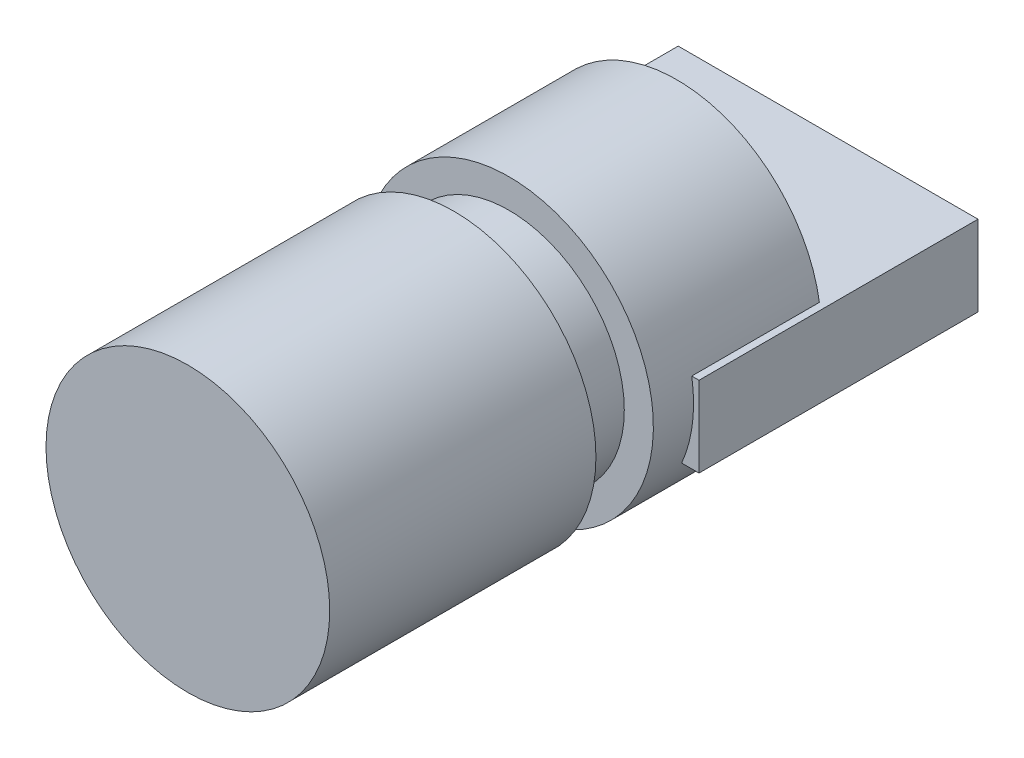
ISO-10303-21;
HEADER;
FILE_DESCRIPTION(('STEP AP214'),'2;1');
FILE_NAME('part.step','',(''),(''),'','','');
FILE_SCHEMA(('AUTOMOTIVE_DESIGN { 1 0 10303 214 1 1 1 1 }'));
ENDSEC;
DATA;
#1=APPLICATION_CONTEXT('core data for automotive mechanical design processes');
#2=APPLICATION_PROTOCOL_DEFINITION('international standard','automotive_design',2000,#1);
#3=PRODUCT_CONTEXT('',#1,'mechanical');
#4=PRODUCT('Part','Part','',(#3));
#5=PRODUCT_RELATED_PRODUCT_CATEGORY('part','',(#4));
#6=PRODUCT_DEFINITION_FORMATION('','',#4);
#7=PRODUCT_DEFINITION_CONTEXT('part definition',#1,'design');
#8=PRODUCT_DEFINITION('design','',#6,#7);
#9=PRODUCT_DEFINITION_SHAPE('','',#8);
#10=(LENGTH_UNIT() NAMED_UNIT(*) SI_UNIT(.MILLI.,.METRE.));
#11=(NAMED_UNIT(*) PLANE_ANGLE_UNIT() SI_UNIT($,.RADIAN.));
#12=(NAMED_UNIT(*) SI_UNIT($,.STERADIAN.) SOLID_ANGLE_UNIT());
#13=UNCERTAINTY_MEASURE_WITH_UNIT(LENGTH_MEASURE(1.E-05),#10,'distance_accuracy_value','');
#14=(GEOMETRIC_REPRESENTATION_CONTEXT(3) GLOBAL_UNCERTAINTY_ASSIGNED_CONTEXT((#13)) GLOBAL_UNIT_ASSIGNED_CONTEXT((#10,
#11,#12)) REPRESENTATION_CONTEXT('',''));
#15=CARTESIAN_POINT('',(0.,0.,0.));
#16=DIRECTION('',(0.,0.,1.));
#17=DIRECTION('',(1.,0.,0.));
#18=AXIS2_PLACEMENT_3D('',#15,#16,#17);
#19=CARTESIAN_POINT('',(-7.67170946047865,4.79889910932069,-4.71));
#20=DIRECTION('',(0.,0.,-1.));
#21=DIRECTION('',(-1.,0.,0.));
#22=AXIS2_PLACEMENT_3D('',#19,#20,#21);
#23=PLANE('',#22);
#24=CARTESIAN_POINT('',(-7.67170946047865,4.79889910932069,-4.71));
#25=DIRECTION('',(0.,0.,-1.));
#26=DIRECTION('',(-1.,0.,0.));
#27=AXIS2_PLACEMENT_3D('',#24,#25,#26);
#28=CIRCLE('',#27,3.055);
#29=CARTESIAN_POINT('',(-4.86871106590187,3.58389910932069,-4.71));
#30=VERTEX_POINT('',#29);
#31=CARTESIAN_POINT('',(-10.4747078550554,3.58389910932069,-4.71));
#32=VERTEX_POINT('',#31);
#33=EDGE_CURVE('E181',#30,#32,#28,.T.);
#34=ORIENTED_EDGE('',*,*,#33,.T.);
#35=DIRECTION('',(1.,0.,0.));
#36=VECTOR('',#35,1.);
#37=CARTESIAN_POINT('',(-7.67170946047865,3.58389910932069,-4.71));
#38=LINE('',#37,#36);
#39=EDGE_CURVE('E195',#32,#30,#38,.T.);
#40=ORIENTED_EDGE('',*,*,#39,.T.);
#41=EDGE_LOOP('',(#34,#40));
#42=FACE_BOUND('',#41,.T.);
#43=ADVANCED_FACE('F59',(#42),#23,.T.);
#44=CARTESIAN_POINT('',(-7.67170946047865,4.79889910932069,5.63));
#45=DIRECTION('',(0.,0.,-1.));
#46=DIRECTION('',(-1.,0.,0.));
#47=AXIS2_PLACEMENT_3D('',#44,#45,#46);
#48=CYLINDRICAL_SURFACE('',#47,3.);
#49=CARTESIAN_POINT('',(-7.67170946047865,4.79889910932069,5.63));
#50=DIRECTION('',(0.,0.,1.));
#51=DIRECTION('',(1.,0.,0.));
#52=AXIS2_PLACEMENT_3D('',#49,#50,#51);
#53=CIRCLE('',#52,3.);
#54=CARTESIAN_POINT('',(-4.67170946047865,4.79889910932069,5.63));
#55=VERTEX_POINT('',#54);
#56=EDGE_CURVE('E187',#55,#55,#53,.T.);
#57=ORIENTED_EDGE('',*,*,#56,.F.);
#58=EDGE_LOOP('',(#57));
#59=FACE_BOUND('',#58,.T.);
#60=CARTESIAN_POINT('',(-7.67170946047865,4.79889910932069,0.));
#61=DIRECTION('',(0.,0.,1.));
#62=DIRECTION('',(1.,0.,0.));
#63=AXIS2_PLACEMENT_3D('',#60,#61,#62);
#64=CIRCLE('',#63,3.);
#65=CARTESIAN_POINT('',(-4.67170946047865,4.79889910932069,0.));
#66=VERTEX_POINT('',#65);
#67=EDGE_CURVE('E186',#66,#66,#64,.T.);
#68=ORIENTED_EDGE('',*,*,#67,.T.);
#69=EDGE_LOOP('',(#68));
#70=FACE_BOUND('',#69,.T.);
#71=ADVANCED_FACE('F61',(#59,#70),#48,.T.);
#72=CARTESIAN_POINT('',(-7.67170946047865,4.79889910932069,5.63));
#73=DIRECTION('',(0.,0.,1.));
#74=DIRECTION('',(1.,0.,0.));
#75=AXIS2_PLACEMENT_3D('',#72,#73,#74);
#76=PLANE('',#75);
#77=ORIENTED_EDGE('',*,*,#56,.T.);
#78=EDGE_LOOP('',(#77));
#79=FACE_BOUND('',#78,.T.);
#80=ADVANCED_FACE('F231',(#79),#76,.T.);
#81=CARTESIAN_POINT('',(-7.67170946047865,4.79889910932069,0.));
#82=DIRECTION('',(0.,0.,1.));
#83=DIRECTION('',(1.,0.,0.));
#84=AXIS2_PLACEMENT_3D('',#81,#82,#83);
#85=PLANE('',#84);
#86=CARTESIAN_POINT('',(-7.67170946047865,4.79889910932069,0.));
#87=DIRECTION('',(0.,0.,1.));
#88=DIRECTION('',(1.,0.,0.));
#89=AXIS2_PLACEMENT_3D('',#86,#87,#88);
#90=CIRCLE('',#89,2.44);
#91=CARTESIAN_POINT('',(-5.23170946047865,4.79889910932069,0.));
#92=VERTEX_POINT('',#91);
#93=EDGE_CURVE('E190',#92,#92,#90,.F.);
#94=ORIENTED_EDGE('',*,*,#93,.F.);
#95=EDGE_LOOP('',(#94));
#96=FACE_BOUND('',#95,.T.);
#97=ORIENTED_EDGE('',*,*,#67,.F.);
#98=EDGE_LOOP('',(#97));
#99=FACE_BOUND('',#98,.T.);
#100=ADVANCED_FACE('F236',(#96,#99),#85,.F.);
#101=CARTESIAN_POINT('',(-7.67170946047865,4.79889910932069,-1.16));
#102=DIRECTION('',(0.,0.,1.));
#103=DIRECTION('',(1.,0.,0.));
#104=AXIS2_PLACEMENT_3D('',#101,#102,#103);
#105=CYLINDRICAL_SURFACE('',#104,2.44);
#106=CARTESIAN_POINT('',(-7.67170946047865,4.79889910932069,-1.16));
#107=DIRECTION('',(0.,0.,-1.));
#108=DIRECTION('',(-1.,0.,0.));
#109=AXIS2_PLACEMENT_3D('',#106,#107,#108);
#110=CIRCLE('',#109,2.44);
#111=CARTESIAN_POINT('',(-10.1117094604786,4.79889910932069,-1.16));
#112=VERTEX_POINT('',#111);
#113=EDGE_CURVE('E180',#112,#112,#110,.T.);
#114=ORIENTED_EDGE('',*,*,#113,.F.);
#115=EDGE_LOOP('',(#114));
#116=FACE_BOUND('',#115,.T.);
#117=ORIENTED_EDGE('',*,*,#93,.T.);
#118=EDGE_LOOP('',(#117));
#119=FACE_BOUND('',#118,.T.);
#120=ADVANCED_FACE('F223',(#116,#119),#105,.T.);
#121=CARTESIAN_POINT('',(-7.67170946047865,4.79889910932069,-4.71));
#122=DIRECTION('',(0.,0.,1.));
#123=DIRECTION('',(1.,0.,0.));
#124=AXIS2_PLACEMENT_3D('',#121,#122,#123);
#125=CYLINDRICAL_SURFACE('',#124,3.055);
#126=CARTESIAN_POINT('',(-10.6879654177873,5.28389910932069,-4.71));
#127=VERTEX_POINT('',#126);
#128=CARTESIAN_POINT('',(-4.65545350316999,5.28389910932069,-4.71));
#129=VERTEX_POINT('',#128);
#130=EDGE_CURVE('E177',#127,#129,#28,.T.);
#131=ORIENTED_EDGE('',*,*,#130,.F.);
#132=DIRECTION('',(0.,0.,1.));
#133=VECTOR('',#132,1.);
#134=CARTESIAN_POINT('',(-10.6879654177873,5.28389910932069,-4.71));
#135=LINE('',#134,#133);
#136=CARTESIAN_POINT('',(-10.6879654177873,5.28389910932069,-2.01));
#137=VERTEX_POINT('',#136);
#138=EDGE_CURVE('E173',#127,#137,#135,.T.);
#139=ORIENTED_EDGE('',*,*,#138,.T.);
#140=CARTESIAN_POINT('',(-7.67170946047865,4.79889910932069,-2.01));
#141=DIRECTION('',(0.,0.,1.));
#142=DIRECTION('',(1.,0.,0.));
#143=AXIS2_PLACEMENT_3D('',#140,#141,#142);
#144=CIRCLE('',#143,3.055);
#145=CARTESIAN_POINT('',(-10.4747078550554,3.58389910932069,-2.01));
#146=VERTEX_POINT('',#145);
#147=EDGE_CURVE('E12',#137,#146,#144,.T.);
#148=ORIENTED_EDGE('',*,*,#147,.T.);
#149=DIRECTION('',(0.,0.,1.));
#150=VECTOR('',#149,1.);
#151=CARTESIAN_POINT('',(-10.4747078550554,3.58389910932069,-4.71));
#152=LINE('',#151,#150);
#153=EDGE_CURVE('E169',#32,#146,#152,.T.);
#154=ORIENTED_EDGE('',*,*,#153,.F.);
#155=ORIENTED_EDGE('',*,*,#33,.F.);
#156=DIRECTION('',(0.,0.,1.));
#157=VECTOR('',#156,1.);
#158=CARTESIAN_POINT('',(-4.86871106590187,3.58389910932069,-4.71));
#159=LINE('',#158,#157);
#160=CARTESIAN_POINT('',(-4.86871106590187,3.58389910932069,-2.01));
#161=VERTEX_POINT('',#160);
#162=EDGE_CURVE('E74',#161,#30,#159,.F.);
#163=ORIENTED_EDGE('',*,*,#162,.F.);
#164=CARTESIAN_POINT('',(-4.65545350316999,5.28389910932069,-2.01));
#165=VERTEX_POINT('',#164);
#166=EDGE_CURVE('E63',#161,#165,#144,.T.);
#167=ORIENTED_EDGE('',*,*,#166,.T.);
#168=DIRECTION('',(0.,0.,1.));
#169=VECTOR('',#168,1.);
#170=CARTESIAN_POINT('',(-4.65545350316999,5.28389910932069,-4.71));
#171=LINE('',#170,#169);
#172=EDGE_CURVE('E171',#165,#129,#171,.F.);
#173=ORIENTED_EDGE('',*,*,#172,.T.);
#174=EDGE_LOOP('',(#131,#139,#148,#154,#155,#163,#167,#173));
#175=FACE_BOUND('',#174,.T.);
#176=CARTESIAN_POINT('',(-7.67170946047865,4.79889910932069,-1.16));
#177=DIRECTION('',(0.,0.,-1.));
#178=DIRECTION('',(-1.,0.,0.));
#179=AXIS2_PLACEMENT_3D('',#176,#177,#178);
#180=CIRCLE('',#179,3.055);
#181=CARTESIAN_POINT('',(-10.7267094604786,4.79889910932069,-1.16));
#182=VERTEX_POINT('',#181);
#183=EDGE_CURVE('E176',#182,#182,#180,.T.);
#184=ORIENTED_EDGE('',*,*,#183,.T.);
#185=EDGE_LOOP('',(#184));
#186=FACE_BOUND('',#185,.T.);
#187=ADVANCED_FACE('F198',(#175,#186),#125,.T.);
#188=DIRECTION('',(1.,0.,0.));
#189=VECTOR('',#188,1.);
#190=CARTESIAN_POINT('',(-7.67170946047865,5.28389910932069,-4.71));
#191=LINE('',#190,#189);
#192=EDGE_CURVE('E82',#127,#129,#191,.T.);
#193=ORIENTED_EDGE('',*,*,#192,.F.);
#194=ORIENTED_EDGE('',*,*,#130,.T.);
#195=EDGE_LOOP('',(#193,#194));
#196=FACE_BOUND('',#195,.T.);
#197=ADVANCED_FACE('F212',(#196),#23,.T.);
#198=CARTESIAN_POINT('',(-7.67170946047865,4.79889910932069,-1.16));
#199=DIRECTION('',(0.,0.,-1.));
#200=DIRECTION('',(-1.,0.,0.));
#201=AXIS2_PLACEMENT_3D('',#198,#199,#200);
#202=PLANE('',#201);
#203=ORIENTED_EDGE('',*,*,#113,.T.);
#204=EDGE_LOOP('',(#203));
#205=FACE_BOUND('',#204,.T.);
#206=ORIENTED_EDGE('',*,*,#183,.F.);
#207=EDGE_LOOP('',(#206));
#208=FACE_BOUND('',#207,.T.);
#209=ADVANCED_FACE('F214',(#205,#208),#202,.F.);
#210=CARTESIAN_POINT('',(0.,3.58389910932069,-2.01));
#211=DIRECTION('',(0.,0.,1.));
#212=DIRECTION('',(1.,0.,0.));
#213=AXIS2_PLACEMENT_3D('',#210,#211,#212);
#214=PLANE('',#213);
#215=ORIENTED_EDGE('',*,*,#147,.F.);
#216=DIRECTION('',(1.,0.,0.));
#217=VECTOR('',#216,1.);
#218=CARTESIAN_POINT('',(0.,5.28389910932069,-2.01));
#219=LINE('',#218,#217);
#220=CARTESIAN_POINT('',(-10.8417094604786,5.28389910932069,-2.01));
#221=VERTEX_POINT('',#220);
#222=EDGE_CURVE('E153',#221,#137,#219,.T.);
#223=ORIENTED_EDGE('',*,*,#222,.F.);
#224=DIRECTION('',(0.,1.,0.));
#225=VECTOR('',#224,1.);
#226=CARTESIAN_POINT('',(-10.8417094604786,3.58389910932069,-2.01));
#227=LINE('',#226,#225);
#228=CARTESIAN_POINT('',(-10.8417094604786,3.58389910932069,-2.01));
#229=VERTEX_POINT('',#228);
#230=EDGE_CURVE('E162',#229,#221,#227,.T.);
#231=ORIENTED_EDGE('',*,*,#230,.F.);
#232=DIRECTION('',(1.,0.,0.));
#233=VECTOR('',#232,1.);
#234=CARTESIAN_POINT('',(0.,3.58389910932069,-2.01));
#235=LINE('',#234,#233);
#236=EDGE_CURVE('E132',#229,#146,#235,.T.);
#237=ORIENTED_EDGE('',*,*,#236,.T.);
#238=EDGE_LOOP('',(#215,#223,#231,#237));
#239=FACE_BOUND('',#238,.T.);
#240=ADVANCED_FACE('F206',(#239),#214,.T.);
#241=CARTESIAN_POINT('',(0.,5.28389910932069,0.));
#242=DIRECTION('',(0.,1.,0.));
#243=DIRECTION('',(0.,0.,1.));
#244=AXIS2_PLACEMENT_3D('',#241,#242,#243);
#245=PLANE('',#244);
#246=ORIENTED_EDGE('',*,*,#138,.F.);
#247=ORIENTED_EDGE('',*,*,#192,.T.);
#248=ORIENTED_EDGE('',*,*,#172,.F.);
#249=CARTESIAN_POINT('',(-4.50170946047865,5.28389910932069,-2.01));
#250=VERTEX_POINT('',#249);
#251=EDGE_CURVE('E156',#165,#250,#219,.T.);
#252=ORIENTED_EDGE('',*,*,#251,.T.);
#253=DIRECTION('',(0.,0.,-1.));
#254=VECTOR('',#253,1.);
#255=CARTESIAN_POINT('',(-4.50170946047865,5.28389910932069,0.));
#256=LINE('',#255,#254);
#257=CARTESIAN_POINT('',(-4.50170946047865,5.28389910932069,-7.91));
#258=VERTEX_POINT('',#257);
#259=EDGE_CURVE('E140',#250,#258,#256,.T.);
#260=ORIENTED_EDGE('',*,*,#259,.T.);
#261=DIRECTION('',(1.,0.,0.));
#262=VECTOR('',#261,1.);
#263=CARTESIAN_POINT('',(0.,5.28389910932069,-7.91));
#264=LINE('',#263,#262);
#265=CARTESIAN_POINT('',(-10.8417094604786,5.28389910932069,-7.91));
#266=VERTEX_POINT('',#265);
#267=EDGE_CURVE('E158',#266,#258,#264,.T.);
#268=ORIENTED_EDGE('',*,*,#267,.F.);
#269=DIRECTION('',(0.,0.,-1.));
#270=VECTOR('',#269,1.);
#271=CARTESIAN_POINT('',(-10.8417094604786,5.28389910932069,0.));
#272=LINE('',#271,#270);
#273=EDGE_CURVE('E133',#221,#266,#272,.T.);
#274=ORIENTED_EDGE('',*,*,#273,.F.);
#275=ORIENTED_EDGE('',*,*,#222,.T.);
#276=EDGE_LOOP('',(#246,#247,#248,#252,#260,#268,#274,#275));
#277=FACE_BOUND('',#276,.T.);
#278=ADVANCED_FACE('F209',(#277),#245,.T.);
#279=CARTESIAN_POINT('',(0.,3.58389910932069,0.));
#280=DIRECTION('',(0.,1.,0.));
#281=DIRECTION('',(0.,0.,1.));
#282=AXIS2_PLACEMENT_3D('',#279,#280,#281);
#283=PLANE('',#282);
#284=ORIENTED_EDGE('',*,*,#39,.F.);
#285=ORIENTED_EDGE('',*,*,#153,.T.);
#286=ORIENTED_EDGE('',*,*,#236,.F.);
#287=DIRECTION('',(0.,0.,-1.));
#288=VECTOR('',#287,1.);
#289=CARTESIAN_POINT('',(-10.8417094604786,3.58389910932069,0.));
#290=LINE('',#289,#288);
#291=CARTESIAN_POINT('',(-10.8417094604786,3.58389910932069,-7.91));
#292=VERTEX_POINT('',#291);
#293=EDGE_CURVE('E142',#229,#292,#290,.T.);
#294=ORIENTED_EDGE('',*,*,#293,.T.);
#295=DIRECTION('',(1.,0.,0.));
#296=VECTOR('',#295,1.);
#297=CARTESIAN_POINT('',(0.,3.58389910932069,-7.91));
#298=LINE('',#297,#296);
#299=CARTESIAN_POINT('',(-4.50170946047865,3.58389910932069,-7.91));
#300=VERTEX_POINT('',#299);
#301=EDGE_CURVE('E146',#292,#300,#298,.T.);
#302=ORIENTED_EDGE('',*,*,#301,.T.);
#303=DIRECTION('',(0.,0.,-1.));
#304=VECTOR('',#303,1.);
#305=CARTESIAN_POINT('',(-4.50170946047865,3.58389910932069,0.));
#306=LINE('',#305,#304);
#307=CARTESIAN_POINT('',(-4.50170946047865,3.58389910932069,-2.01));
#308=VERTEX_POINT('',#307);
#309=EDGE_CURVE('E138',#308,#300,#306,.T.);
#310=ORIENTED_EDGE('',*,*,#309,.F.);
#311=EDGE_CURVE('E124',#161,#308,#235,.T.);
#312=ORIENTED_EDGE('',*,*,#311,.F.);
#313=ORIENTED_EDGE('',*,*,#162,.T.);
#314=EDGE_LOOP('',(#284,#285,#286,#294,#302,#310,#312,#313));
#315=FACE_BOUND('',#314,.T.);
#316=ADVANCED_FACE('F144',(#315),#283,.F.);
#317=ORIENTED_EDGE('',*,*,#166,.F.);
#318=ORIENTED_EDGE('',*,*,#311,.T.);
#319=DIRECTION('',(0.,1.,0.));
#320=VECTOR('',#319,1.);
#321=CARTESIAN_POINT('',(-4.50170946047865,3.58389910932069,-2.01));
#322=LINE('',#321,#320);
#323=EDGE_CURVE('E128',#308,#250,#322,.T.);
#324=ORIENTED_EDGE('',*,*,#323,.T.);
#325=ORIENTED_EDGE('',*,*,#251,.F.);
#326=EDGE_LOOP('',(#317,#318,#324,#325));
#327=FACE_BOUND('',#326,.T.);
#328=ADVANCED_FACE('F126',(#327),#214,.T.);
#329=CARTESIAN_POINT('',(-4.50170946047865,3.58389910932069,0.));
#330=DIRECTION('',(1.,0.,0.));
#331=DIRECTION('',(0.,0.,-1.));
#332=AXIS2_PLACEMENT_3D('',#329,#330,#331);
#333=PLANE('',#332);
#334=ORIENTED_EDGE('',*,*,#259,.F.);
#335=ORIENTED_EDGE('',*,*,#323,.F.);
#336=ORIENTED_EDGE('',*,*,#309,.T.);
#337=DIRECTION('',(0.,1.,0.));
#338=VECTOR('',#337,1.);
#339=CARTESIAN_POINT('',(-4.50170946047865,3.58389910932069,-7.91));
#340=LINE('',#339,#338);
#341=EDGE_CURVE('E141',#300,#258,#340,.T.);
#342=ORIENTED_EDGE('',*,*,#341,.T.);
#343=EDGE_LOOP('',(#334,#335,#336,#342));
#344=FACE_BOUND('',#343,.T.);
#345=ADVANCED_FACE('F137',(#344),#333,.T.);
#346=CARTESIAN_POINT('',(0.,3.58389910932069,-7.91));
#347=DIRECTION('',(0.,0.,1.));
#348=DIRECTION('',(1.,0.,0.));
#349=AXIS2_PLACEMENT_3D('',#346,#347,#348);
#350=PLANE('',#349);
#351=ORIENTED_EDGE('',*,*,#267,.T.);
#352=ORIENTED_EDGE('',*,*,#341,.F.);
#353=ORIENTED_EDGE('',*,*,#301,.F.);
#354=DIRECTION('',(0.,1.,0.));
#355=VECTOR('',#354,1.);
#356=CARTESIAN_POINT('',(-10.8417094604786,3.58389910932069,-7.91));
#357=LINE('',#356,#355);
#358=EDGE_CURVE('E164',#292,#266,#357,.T.);
#359=ORIENTED_EDGE('',*,*,#358,.T.);
#360=EDGE_LOOP('',(#351,#352,#353,#359));
#361=FACE_BOUND('',#360,.T.);
#362=ADVANCED_FACE('F302',(#361),#350,.F.);
#363=CARTESIAN_POINT('',(-10.8417094604786,3.58389910932069,0.));
#364=DIRECTION('',(1.,0.,0.));
#365=DIRECTION('',(0.,0.,-1.));
#366=AXIS2_PLACEMENT_3D('',#363,#364,#365);
#367=PLANE('',#366);
#368=ORIENTED_EDGE('',*,*,#273,.T.);
#369=ORIENTED_EDGE('',*,*,#358,.F.);
#370=ORIENTED_EDGE('',*,*,#293,.F.);
#371=ORIENTED_EDGE('',*,*,#230,.T.);
#372=EDGE_LOOP('',(#368,#369,#370,#371));
#373=FACE_BOUND('',#372,.T.);
#374=ADVANCED_FACE('F309',(#373),#367,.F.);
#375=CLOSED_SHELL('',(#43,#71,#80,#100,#120,#187,#197,#209,#240,#278,#316,#328,#345,#362,#374));
#376=MANIFOLD_SOLID_BREP('B2',#375);
#377=ADVANCED_BREP_SHAPE_REPRESENTATION('',(#18,#376),#14);
#378=SHAPE_DEFINITION_REPRESENTATION(#9,#377);
ENDSEC;
END-ISO-10303-21;
